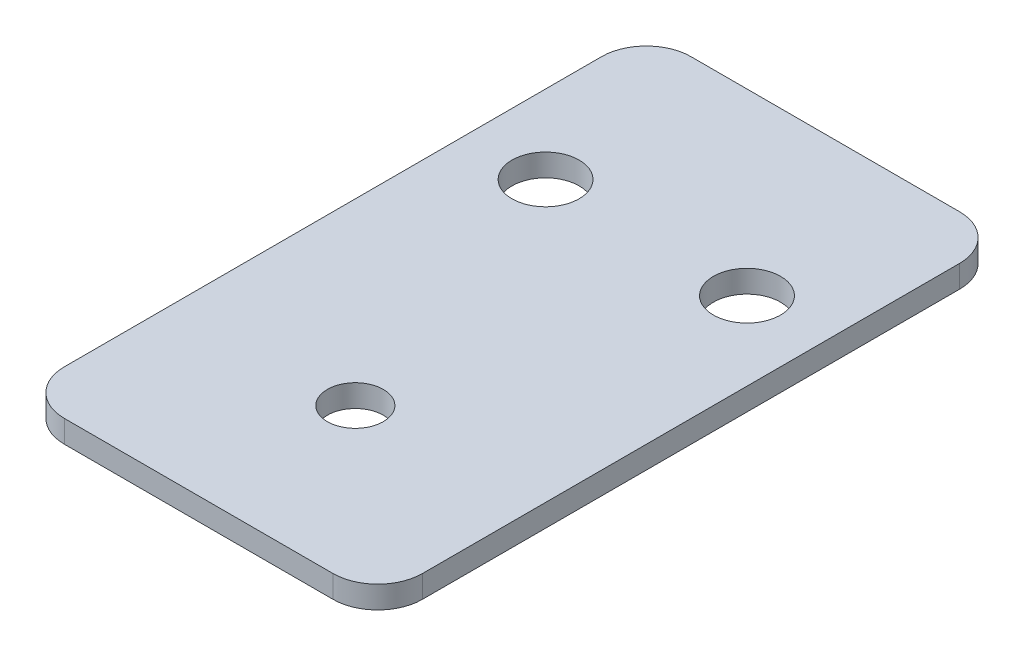
ISO-10303-21;
HEADER;
FILE_DESCRIPTION(('STEP AP214'),'2;1');
FILE_NAME('part.step','',(''),(''),'','','');
FILE_SCHEMA(('AUTOMOTIVE_DESIGN { 1 0 10303 214 1 1 1 1 }'));
ENDSEC;
DATA;
#1=APPLICATION_CONTEXT('core data for automotive mechanical design processes');
#2=APPLICATION_PROTOCOL_DEFINITION('international standard','automotive_design',2000,#1);
#3=PRODUCT_CONTEXT('',#1,'mechanical');
#4=PRODUCT('Part','Part','',(#3));
#5=PRODUCT_RELATED_PRODUCT_CATEGORY('part','',(#4));
#6=PRODUCT_DEFINITION_FORMATION('','',#4);
#7=PRODUCT_DEFINITION_CONTEXT('part definition',#1,'design');
#8=PRODUCT_DEFINITION('design','',#6,#7);
#9=PRODUCT_DEFINITION_SHAPE('','',#8);
#10=(LENGTH_UNIT() NAMED_UNIT(*) SI_UNIT(.MILLI.,.METRE.));
#11=(NAMED_UNIT(*) PLANE_ANGLE_UNIT() SI_UNIT($,.RADIAN.));
#12=(NAMED_UNIT(*) SI_UNIT($,.STERADIAN.) SOLID_ANGLE_UNIT());
#13=UNCERTAINTY_MEASURE_WITH_UNIT(LENGTH_MEASURE(1.E-05),#10,'distance_accuracy_value','');
#14=(GEOMETRIC_REPRESENTATION_CONTEXT(3) GLOBAL_UNCERTAINTY_ASSIGNED_CONTEXT((#13)) GLOBAL_UNIT_ASSIGNED_CONTEXT((#10,
#11,#12)) REPRESENTATION_CONTEXT('',''));
#15=CARTESIAN_POINT('',(0.,0.,0.));
#16=DIRECTION('',(0.,0.,1.));
#17=DIRECTION('',(1.,0.,0.));
#18=AXIS2_PLACEMENT_3D('',#15,#16,#17);
#19=CARTESIAN_POINT('',(16.,-2.,-28.));
#20=DIRECTION('',(1.,0.,0.));
#21=DIRECTION('',(0.,0.,1.));
#22=AXIS2_PLACEMENT_3D('',#19,#20,#21);
#23=PLANE('',#22);
#24=DIRECTION('',(0.,0.,1.));
#25=VECTOR('',#24,1.);
#26=CARTESIAN_POINT('',(16.,0.,-28.));
#27=LINE('',#26,#25);
#28=CARTESIAN_POINT('',(16.,0.,-24.));
#29=VERTEX_POINT('',#28);
#30=CARTESIAN_POINT('',(16.,0.,24.));
#31=VERTEX_POINT('',#30);
#32=EDGE_CURVE('E193',#29,#31,#27,.T.);
#33=ORIENTED_EDGE('',*,*,#32,.T.);
#34=DIRECTION('',(0.,1.,0.));
#35=VECTOR('',#34,1.);
#36=CARTESIAN_POINT('',(16.,-2.,24.));
#37=LINE('',#36,#35);
#38=CARTESIAN_POINT('',(16.,-2.,24.));
#39=VERTEX_POINT('',#38);
#40=EDGE_CURVE('E160',#39,#31,#37,.T.);
#41=ORIENTED_EDGE('',*,*,#40,.F.);
#42=DIRECTION('',(0.,0.,1.));
#43=VECTOR('',#42,1.);
#44=CARTESIAN_POINT('',(16.,-2.,-28.));
#45=LINE('',#44,#43);
#46=CARTESIAN_POINT('',(16.,-2.,-24.));
#47=VERTEX_POINT('',#46);
#48=EDGE_CURVE('E136',#47,#39,#45,.T.);
#49=ORIENTED_EDGE('',*,*,#48,.F.);
#50=DIRECTION('',(0.,1.,0.));
#51=VECTOR('',#50,1.);
#52=CARTESIAN_POINT('',(16.,-2.,-24.));
#53=LINE('',#52,#51);
#54=EDGE_CURVE('E164',#29,#47,#53,.F.);
#55=ORIENTED_EDGE('',*,*,#54,.F.);
#56=EDGE_LOOP('',(#33,#41,#49,#55));
#57=FACE_BOUND('',#56,.T.);
#58=ADVANCED_FACE('F47',(#57),#23,.T.);
#59=CARTESIAN_POINT('',(-16.,-2.,-28.));
#60=DIRECTION('',(0.,0.,-1.));
#61=DIRECTION('',(1.,0.,0.));
#62=AXIS2_PLACEMENT_3D('',#59,#60,#61);
#63=PLANE('',#62);
#64=DIRECTION('',(1.,0.,0.));
#65=VECTOR('',#64,1.);
#66=CARTESIAN_POINT('',(-16.,-2.,-28.));
#67=LINE('',#66,#65);
#68=CARTESIAN_POINT('',(-12.,-2.,-28.));
#69=VERTEX_POINT('',#68);
#70=CARTESIAN_POINT('',(12.,-2.,-28.));
#71=VERTEX_POINT('',#70);
#72=EDGE_CURVE('E141',#69,#71,#67,.T.);
#73=ORIENTED_EDGE('',*,*,#72,.F.);
#74=DIRECTION('',(0.,1.,0.));
#75=VECTOR('',#74,1.);
#76=CARTESIAN_POINT('',(-12.,-2.,-28.));
#77=LINE('',#76,#75);
#78=CARTESIAN_POINT('',(-12.,0.,-28.));
#79=VERTEX_POINT('',#78);
#80=EDGE_CURVE('E117',#79,#69,#77,.F.);
#81=ORIENTED_EDGE('',*,*,#80,.F.);
#82=DIRECTION('',(1.,0.,0.));
#83=VECTOR('',#82,1.);
#84=CARTESIAN_POINT('',(-16.,0.,-28.));
#85=LINE('',#84,#83);
#86=CARTESIAN_POINT('',(12.,0.,-28.));
#87=VERTEX_POINT('',#86);
#88=EDGE_CURVE('E129',#79,#87,#85,.T.);
#89=ORIENTED_EDGE('',*,*,#88,.T.);
#90=DIRECTION('',(0.,1.,0.));
#91=VECTOR('',#90,1.);
#92=CARTESIAN_POINT('',(12.,-2.,-28.));
#93=LINE('',#92,#91);
#94=EDGE_CURVE('E143',#71,#87,#93,.T.);
#95=ORIENTED_EDGE('',*,*,#94,.F.);
#96=EDGE_LOOP('',(#73,#81,#89,#95));
#97=FACE_BOUND('',#96,.T.);
#98=ADVANCED_FACE('F139',(#97),#63,.T.);
#99=CARTESIAN_POINT('',(-16.,-2.,-28.));
#100=DIRECTION('',(-1.,0.,0.));
#101=DIRECTION('',(0.,0.,-1.));
#102=AXIS2_PLACEMENT_3D('',#99,#100,#101);
#103=PLANE('',#102);
#104=DIRECTION('',(0.,0.,-1.));
#105=VECTOR('',#104,1.);
#106=CARTESIAN_POINT('',(-16.,-2.,-28.));
#107=LINE('',#106,#105);
#108=CARTESIAN_POINT('',(-16.,-2.,24.));
#109=VERTEX_POINT('',#108);
#110=CARTESIAN_POINT('',(-16.,-2.,-24.));
#111=VERTEX_POINT('',#110);
#112=EDGE_CURVE('E150',#109,#111,#107,.T.);
#113=ORIENTED_EDGE('',*,*,#112,.F.);
#114=DIRECTION('',(0.,1.,0.));
#115=VECTOR('',#114,1.);
#116=CARTESIAN_POINT('',(-16.,-2.,24.));
#117=LINE('',#116,#115);
#118=CARTESIAN_POINT('',(-16.,0.,24.));
#119=VERTEX_POINT('',#118);
#120=EDGE_CURVE('E178',#119,#109,#117,.F.);
#121=ORIENTED_EDGE('',*,*,#120,.F.);
#122=DIRECTION('',(0.,0.,-1.));
#123=VECTOR('',#122,1.);
#124=CARTESIAN_POINT('',(-16.,0.,-28.));
#125=LINE('',#124,#123);
#126=CARTESIAN_POINT('',(-16.,0.,-24.));
#127=VERTEX_POINT('',#126);
#128=EDGE_CURVE('E137',#119,#127,#125,.T.);
#129=ORIENTED_EDGE('',*,*,#128,.T.);
#130=DIRECTION('',(0.,1.,0.));
#131=VECTOR('',#130,1.);
#132=CARTESIAN_POINT('',(-16.,-2.,-24.));
#133=LINE('',#132,#131);
#134=EDGE_CURVE('E120',#111,#127,#133,.T.);
#135=ORIENTED_EDGE('',*,*,#134,.F.);
#136=EDGE_LOOP('',(#113,#121,#129,#135));
#137=FACE_BOUND('',#136,.T.);
#138=ADVANCED_FACE('F254',(#137),#103,.T.);
#139=CARTESIAN_POINT('',(-16.,-2.,28.));
#140=DIRECTION('',(0.,0.,1.));
#141=DIRECTION('',(-1.,0.,0.));
#142=AXIS2_PLACEMENT_3D('',#139,#140,#141);
#143=PLANE('',#142);
#144=DIRECTION('',(-1.,0.,0.));
#145=VECTOR('',#144,1.);
#146=CARTESIAN_POINT('',(-16.,0.,28.));
#147=LINE('',#146,#145);
#148=CARTESIAN_POINT('',(12.,0.,28.));
#149=VERTEX_POINT('',#148);
#150=CARTESIAN_POINT('',(-12.,0.,28.));
#151=VERTEX_POINT('',#150);
#152=EDGE_CURVE('E191',#149,#151,#147,.T.);
#153=ORIENTED_EDGE('',*,*,#152,.T.);
#154=DIRECTION('',(0.,1.,0.));
#155=VECTOR('',#154,1.);
#156=CARTESIAN_POINT('',(-12.,-2.,28.));
#157=LINE('',#156,#155);
#158=CARTESIAN_POINT('',(-12.,-2.,28.));
#159=VERTEX_POINT('',#158);
#160=EDGE_CURVE('E56',#159,#151,#157,.T.);
#161=ORIENTED_EDGE('',*,*,#160,.F.);
#162=DIRECTION('',(-1.,0.,0.));
#163=VECTOR('',#162,1.);
#164=CARTESIAN_POINT('',(-16.,-2.,28.));
#165=LINE('',#164,#163);
#166=CARTESIAN_POINT('',(12.,-2.,28.));
#167=VERTEX_POINT('',#166);
#168=EDGE_CURVE('E205',#167,#159,#165,.T.);
#169=ORIENTED_EDGE('',*,*,#168,.F.);
#170=DIRECTION('',(0.,1.,0.));
#171=VECTOR('',#170,1.);
#172=CARTESIAN_POINT('',(12.,-2.,28.));
#173=LINE('',#172,#171);
#174=EDGE_CURVE('E11',#149,#167,#173,.F.);
#175=ORIENTED_EDGE('',*,*,#174,.F.);
#176=EDGE_LOOP('',(#153,#161,#169,#175));
#177=FACE_BOUND('',#176,.T.);
#178=ADVANCED_FACE('F192',(#177),#143,.T.);
#179=CARTESIAN_POINT('',(0.,-2.,0.));
#180=DIRECTION('',(0.,-1.,0.));
#181=DIRECTION('',(0.,0.,1.));
#182=AXIS2_PLACEMENT_3D('',#179,#180,#181);
#183=PLANE('',#182);
#184=CARTESIAN_POINT('',(-9.,-2.,-12.));
#185=DIRECTION('',(0.,-1.,0.));
#186=DIRECTION('',(0.,0.,-1.));
#187=AXIS2_PLACEMENT_3D('',#184,#185,#186);
#188=CIRCLE('',#187,3.);
#189=CARTESIAN_POINT('',(-9.,-2.,-15.));
#190=VERTEX_POINT('',#189);
#191=EDGE_CURVE('E214',#190,#190,#188,.T.);
#192=ORIENTED_EDGE('',*,*,#191,.F.);
#193=EDGE_LOOP('',(#192));
#194=FACE_BOUND('',#193,.T.);
#195=CARTESIAN_POINT('',(9.,-2.,-12.));
#196=DIRECTION('',(0.,-1.,0.));
#197=DIRECTION('',(0.,0.,-1.));
#198=AXIS2_PLACEMENT_3D('',#195,#196,#197);
#199=CIRCLE('',#198,3.);
#200=CARTESIAN_POINT('',(9.,-2.,-15.));
#201=VERTEX_POINT('',#200);
#202=EDGE_CURVE('E222',#201,#201,#199,.T.);
#203=ORIENTED_EDGE('',*,*,#202,.F.);
#204=EDGE_LOOP('',(#203));
#205=FACE_BOUND('',#204,.T.);
#206=CARTESIAN_POINT('',(0.,-2.,14.));
#207=DIRECTION('',(0.,-1.,0.));
#208=DIRECTION('',(0.,0.,-1.));
#209=AXIS2_PLACEMENT_3D('',#206,#207,#208);
#210=CIRCLE('',#209,2.5);
#211=CARTESIAN_POINT('',(0.,-2.,11.5));
#212=VERTEX_POINT('',#211);
#213=EDGE_CURVE('E199',#212,#212,#210,.T.);
#214=ORIENTED_EDGE('',*,*,#213,.F.);
#215=EDGE_LOOP('',(#214));
#216=FACE_BOUND('',#215,.T.);
#217=ORIENTED_EDGE('',*,*,#48,.T.);
#218=CARTESIAN_POINT('',(12.,-2.,24.));
#219=DIRECTION('',(0.,1.,0.));
#220=DIRECTION('',(0.,0.,1.));
#221=AXIS2_PLACEMENT_3D('',#218,#219,#220);
#222=CIRCLE('',#221,4.);
#223=EDGE_CURVE('E70',#167,#39,#222,.T.);
#224=ORIENTED_EDGE('',*,*,#223,.F.);
#225=ORIENTED_EDGE('',*,*,#168,.T.);
#226=CARTESIAN_POINT('',(-12.,-2.,24.));
#227=DIRECTION('',(0.,1.,0.));
#228=DIRECTION('',(0.,0.,1.));
#229=AXIS2_PLACEMENT_3D('',#226,#227,#228);
#230=CIRCLE('',#229,4.);
#231=EDGE_CURVE('E63',#109,#159,#230,.T.);
#232=ORIENTED_EDGE('',*,*,#231,.F.);
#233=ORIENTED_EDGE('',*,*,#112,.T.);
#234=CARTESIAN_POINT('',(-12.,-2.,-24.));
#235=DIRECTION('',(0.,1.,0.));
#236=DIRECTION('',(0.,0.,1.));
#237=AXIS2_PLACEMENT_3D('',#234,#235,#236);
#238=CIRCLE('',#237,4.);
#239=EDGE_CURVE('E172',#69,#111,#238,.T.);
#240=ORIENTED_EDGE('',*,*,#239,.F.);
#241=ORIENTED_EDGE('',*,*,#72,.T.);
#242=CARTESIAN_POINT('',(12.,-2.,-24.));
#243=DIRECTION('',(0.,1.,0.));
#244=DIRECTION('',(0.,0.,1.));
#245=AXIS2_PLACEMENT_3D('',#242,#243,#244);
#246=CIRCLE('',#245,4.);
#247=EDGE_CURVE('E175',#47,#71,#246,.T.);
#248=ORIENTED_EDGE('',*,*,#247,.F.);
#249=EDGE_LOOP('',(#217,#224,#225,#232,#233,#240,#241,#248));
#250=FACE_BOUND('',#249,.T.);
#251=ADVANCED_FACE('F238',(#194,#205,#216,#250),#183,.T.);
#252=CARTESIAN_POINT('',(0.,0.,0.));
#253=DIRECTION('',(0.,-1.,0.));
#254=DIRECTION('',(0.,0.,1.));
#255=AXIS2_PLACEMENT_3D('',#252,#253,#254);
#256=PLANE('',#255);
#257=CARTESIAN_POINT('',(-9.,0.,-12.));
#258=DIRECTION('',(0.,-1.,0.));
#259=DIRECTION('',(0.,0.,-1.));
#260=AXIS2_PLACEMENT_3D('',#257,#258,#259);
#261=CIRCLE('',#260,3.);
#262=CARTESIAN_POINT('',(-9.,0.,-15.));
#263=VERTEX_POINT('',#262);
#264=EDGE_CURVE('E226',#263,#263,#261,.T.);
#265=ORIENTED_EDGE('',*,*,#264,.T.);
#266=EDGE_LOOP('',(#265));
#267=FACE_BOUND('',#266,.T.);
#268=CARTESIAN_POINT('',(9.,0.,-12.));
#269=DIRECTION('',(0.,-1.,0.));
#270=DIRECTION('',(0.,0.,-1.));
#271=AXIS2_PLACEMENT_3D('',#268,#269,#270);
#272=CIRCLE('',#271,3.);
#273=CARTESIAN_POINT('',(9.,0.,-15.));
#274=VERTEX_POINT('',#273);
#275=EDGE_CURVE('E218',#274,#274,#272,.T.);
#276=ORIENTED_EDGE('',*,*,#275,.T.);
#277=EDGE_LOOP('',(#276));
#278=FACE_BOUND('',#277,.T.);
#279=CARTESIAN_POINT('',(0.,0.,14.));
#280=DIRECTION('',(0.,-1.,0.));
#281=DIRECTION('',(0.,0.,-1.));
#282=AXIS2_PLACEMENT_3D('',#279,#280,#281);
#283=CIRCLE('',#282,2.5);
#284=CARTESIAN_POINT('',(0.,0.,11.5));
#285=VERTEX_POINT('',#284);
#286=EDGE_CURVE('E210',#285,#285,#283,.T.);
#287=ORIENTED_EDGE('',*,*,#286,.T.);
#288=EDGE_LOOP('',(#287));
#289=FACE_BOUND('',#288,.T.);
#290=ORIENTED_EDGE('',*,*,#88,.F.);
#291=CARTESIAN_POINT('',(-12.,0.,-24.));
#292=DIRECTION('',(0.,1.,0.));
#293=DIRECTION('',(0.,0.,1.));
#294=AXIS2_PLACEMENT_3D('',#291,#292,#293);
#295=CIRCLE('',#294,4.);
#296=EDGE_CURVE('E113',#127,#79,#295,.F.);
#297=ORIENTED_EDGE('',*,*,#296,.F.);
#298=ORIENTED_EDGE('',*,*,#128,.F.);
#299=CARTESIAN_POINT('',(-12.,0.,24.));
#300=DIRECTION('',(0.,1.,0.));
#301=DIRECTION('',(0.,0.,1.));
#302=AXIS2_PLACEMENT_3D('',#299,#300,#301);
#303=CIRCLE('',#302,4.);
#304=EDGE_CURVE('E147',#151,#119,#303,.F.);
#305=ORIENTED_EDGE('',*,*,#304,.F.);
#306=ORIENTED_EDGE('',*,*,#152,.F.);
#307=CARTESIAN_POINT('',(12.,0.,24.));
#308=DIRECTION('',(0.,1.,0.));
#309=DIRECTION('',(0.,0.,1.));
#310=AXIS2_PLACEMENT_3D('',#307,#308,#309);
#311=CIRCLE('',#310,4.);
#312=EDGE_CURVE('E126',#31,#149,#311,.F.);
#313=ORIENTED_EDGE('',*,*,#312,.F.);
#314=ORIENTED_EDGE('',*,*,#32,.F.);
#315=CARTESIAN_POINT('',(12.,0.,-24.));
#316=DIRECTION('',(0.,1.,0.));
#317=DIRECTION('',(0.,0.,1.));
#318=AXIS2_PLACEMENT_3D('',#315,#316,#317);
#319=CIRCLE('',#318,4.);
#320=EDGE_CURVE('E125',#87,#29,#319,.F.);
#321=ORIENTED_EDGE('',*,*,#320,.F.);
#322=EDGE_LOOP('',(#290,#297,#298,#305,#306,#313,#314,#321));
#323=FACE_BOUND('',#322,.T.);
#324=ADVANCED_FACE('F130',(#267,#278,#289,#323),#256,.F.);
#325=CARTESIAN_POINT('',(12.,-2.,-24.));
#326=DIRECTION('',(0.,1.,0.));
#327=DIRECTION('',(0.,0.,-1.));
#328=AXIS2_PLACEMENT_3D('',#325,#326,#327);
#329=CYLINDRICAL_SURFACE('',#328,4.);
#330=ORIENTED_EDGE('',*,*,#247,.T.);
#331=ORIENTED_EDGE('',*,*,#94,.T.);
#332=ORIENTED_EDGE('',*,*,#320,.T.);
#333=ORIENTED_EDGE('',*,*,#54,.T.);
#334=EDGE_LOOP('',(#330,#331,#332,#333));
#335=FACE_BOUND('',#334,.T.);
#336=ADVANCED_FACE('F268',(#335),#329,.T.);
#337=CARTESIAN_POINT('',(-12.,-2.,-24.));
#338=DIRECTION('',(0.,1.,0.));
#339=DIRECTION('',(0.,0.,-1.));
#340=AXIS2_PLACEMENT_3D('',#337,#338,#339);
#341=CYLINDRICAL_SURFACE('',#340,4.);
#342=ORIENTED_EDGE('',*,*,#239,.T.);
#343=ORIENTED_EDGE('',*,*,#134,.T.);
#344=ORIENTED_EDGE('',*,*,#296,.T.);
#345=ORIENTED_EDGE('',*,*,#80,.T.);
#346=EDGE_LOOP('',(#342,#343,#344,#345));
#347=FACE_BOUND('',#346,.T.);
#348=ADVANCED_FACE('F115',(#347),#341,.T.);
#349=CARTESIAN_POINT('',(12.,-2.,24.));
#350=DIRECTION('',(0.,1.,0.));
#351=DIRECTION('',(0.,0.,-1.));
#352=AXIS2_PLACEMENT_3D('',#349,#350,#351);
#353=CYLINDRICAL_SURFACE('',#352,4.);
#354=ORIENTED_EDGE('',*,*,#223,.T.);
#355=ORIENTED_EDGE('',*,*,#40,.T.);
#356=ORIENTED_EDGE('',*,*,#312,.T.);
#357=ORIENTED_EDGE('',*,*,#174,.T.);
#358=EDGE_LOOP('',(#354,#355,#356,#357));
#359=FACE_BOUND('',#358,.T.);
#360=ADVANCED_FACE('F250',(#359),#353,.T.);
#361=CARTESIAN_POINT('',(-12.,-2.,24.));
#362=DIRECTION('',(0.,1.,0.));
#363=DIRECTION('',(0.,0.,-1.));
#364=AXIS2_PLACEMENT_3D('',#361,#362,#363);
#365=CYLINDRICAL_SURFACE('',#364,4.);
#366=ORIENTED_EDGE('',*,*,#231,.T.);
#367=ORIENTED_EDGE('',*,*,#160,.T.);
#368=ORIENTED_EDGE('',*,*,#304,.T.);
#369=ORIENTED_EDGE('',*,*,#120,.T.);
#370=EDGE_LOOP('',(#366,#367,#368,#369));
#371=FACE_BOUND('',#370,.T.);
#372=ADVANCED_FACE('F49',(#371),#365,.T.);
#373=CARTESIAN_POINT('',(0.,-2.,14.));
#374=DIRECTION('',(0.,1.,0.));
#375=DIRECTION('',(0.,0.,-1.));
#376=AXIS2_PLACEMENT_3D('',#373,#374,#375);
#377=CYLINDRICAL_SURFACE('',#376,2.5);
#378=ORIENTED_EDGE('',*,*,#213,.T.);
#379=EDGE_LOOP('',(#378));
#380=FACE_BOUND('',#379,.T.);
#381=ORIENTED_EDGE('',*,*,#286,.F.);
#382=EDGE_LOOP('',(#381));
#383=FACE_BOUND('',#382,.T.);
#384=ADVANCED_FACE('F277',(#380,#383),#377,.F.);
#385=CARTESIAN_POINT('',(9.,-2.,-12.));
#386=DIRECTION('',(0.,1.,0.));
#387=DIRECTION('',(0.,0.,-1.));
#388=AXIS2_PLACEMENT_3D('',#385,#386,#387);
#389=CYLINDRICAL_SURFACE('',#388,3.);
#390=ORIENTED_EDGE('',*,*,#202,.T.);
#391=EDGE_LOOP('',(#390));
#392=FACE_BOUND('',#391,.T.);
#393=ORIENTED_EDGE('',*,*,#275,.F.);
#394=EDGE_LOOP('',(#393));
#395=FACE_BOUND('',#394,.T.);
#396=ADVANCED_FACE('F281',(#392,#395),#389,.F.);
#397=CARTESIAN_POINT('',(-9.,-2.,-12.));
#398=DIRECTION('',(0.,1.,0.));
#399=DIRECTION('',(0.,0.,-1.));
#400=AXIS2_PLACEMENT_3D('',#397,#398,#399);
#401=CYLINDRICAL_SURFACE('',#400,3.);
#402=ORIENTED_EDGE('',*,*,#191,.T.);
#403=EDGE_LOOP('',(#402));
#404=FACE_BOUND('',#403,.T.);
#405=ORIENTED_EDGE('',*,*,#264,.F.);
#406=EDGE_LOOP('',(#405));
#407=FACE_BOUND('',#406,.T.);
#408=ADVANCED_FACE('F235',(#404,#407),#401,.F.);
#409=CLOSED_SHELL('',(#58,#98,#138,#178,#251,#324,#336,#348,#360,#372,#384,#396,#408));
#410=MANIFOLD_SOLID_BREP('B2',#409);
#411=ADVANCED_BREP_SHAPE_REPRESENTATION('',(#18,#410),#14);
#412=SHAPE_DEFINITION_REPRESENTATION(#9,#411);
ENDSEC;
END-ISO-10303-21;
